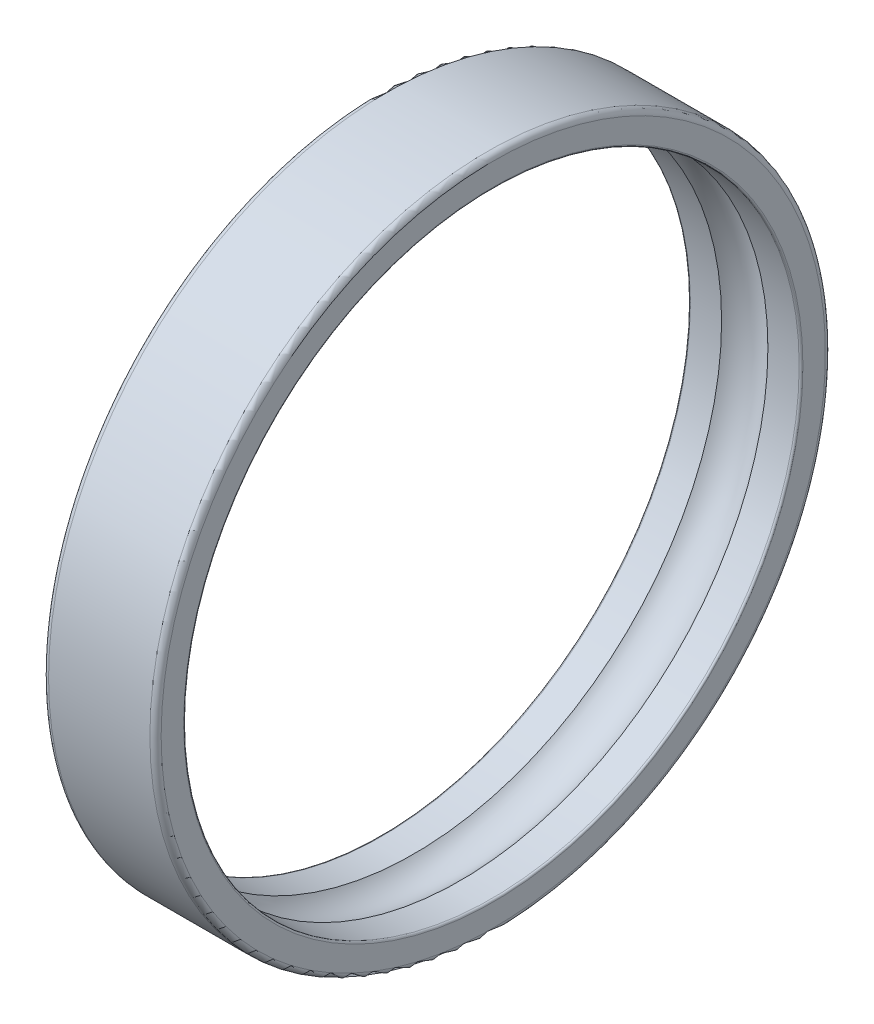
ISO-10303-21;
HEADER;
FILE_DESCRIPTION(('STEP AP214'),'2;1');
FILE_NAME('part.step','',(''),(''),'','','');
FILE_SCHEMA(('AUTOMOTIVE_DESIGN { 1 0 10303 214 1 1 1 1 }'));
ENDSEC;
DATA;
#1=APPLICATION_CONTEXT('core data for automotive mechanical design processes');
#2=APPLICATION_PROTOCOL_DEFINITION('international standard','automotive_design',2000,#1);
#3=PRODUCT_CONTEXT('',#1,'mechanical');
#4=PRODUCT('Part','Part','',(#3));
#5=PRODUCT_RELATED_PRODUCT_CATEGORY('part','',(#4));
#6=PRODUCT_DEFINITION_FORMATION('','',#4);
#7=PRODUCT_DEFINITION_CONTEXT('part definition',#1,'design');
#8=PRODUCT_DEFINITION('design','',#6,#7);
#9=PRODUCT_DEFINITION_SHAPE('','',#8);
#10=(LENGTH_UNIT() NAMED_UNIT(*) SI_UNIT(.MILLI.,.METRE.));
#11=(NAMED_UNIT(*) PLANE_ANGLE_UNIT() SI_UNIT($,.RADIAN.));
#12=(NAMED_UNIT(*) SI_UNIT($,.STERADIAN.) SOLID_ANGLE_UNIT());
#13=UNCERTAINTY_MEASURE_WITH_UNIT(LENGTH_MEASURE(1.E-05),#10,'distance_accuracy_value','');
#14=(GEOMETRIC_REPRESENTATION_CONTEXT(3) GLOBAL_UNCERTAINTY_ASSIGNED_CONTEXT((#13)) GLOBAL_UNIT_ASSIGNED_CONTEXT((#10,
#11,#12)) REPRESENTATION_CONTEXT('',''));
#15=CARTESIAN_POINT('',(0.,0.,0.));
#16=DIRECTION('',(0.,0.,1.));
#17=DIRECTION('',(1.,0.,0.));
#18=AXIS2_PLACEMENT_3D('',#15,#16,#17);
#19=CARTESIAN_POINT('',(0.,-35.792247571582,-35.4));
#20=DIRECTION('',(-1.,0.,0.));
#21=DIRECTION('',(0.,0.,1.));
#22=AXIS2_PLACEMENT_3D('',#19,#20,#21);
#23=PLANE('',#22);
#24=CARTESIAN_POINT('',(0.,0.,0.));
#25=DIRECTION('',(-1.,0.,0.));
#26=DIRECTION('',(0.,0.,-1.));
#27=AXIS2_PLACEMENT_3D('',#24,#25,#26);
#28=CIRCLE('',#27,35.4);
#29=CARTESIAN_POINT('',(0.,0.,-35.4));
#30=VERTEX_POINT('',#29);
#31=EDGE_CURVE('E50',#30,#30,#28,.F.);
#32=ORIENTED_EDGE('',*,*,#31,.F.);
#33=EDGE_LOOP('',(#32));
#34=FACE_BOUND('',#33,.T.);
#35=CARTESIAN_POINT('',(0.,0.,0.));
#36=DIRECTION('',(1.,0.,0.));
#37=DIRECTION('',(0.,-1.1684784856863E-09,1.));
#38=AXIS2_PLACEMENT_3D('',#35,#36,#37);
#39=CIRCLE('',#38,33.0000000000005);
#40=CARTESIAN_POINT('',(0.,-3.85597900276486E-08,33.0000000000005));
#41=VERTEX_POINT('',#40);
#42=EDGE_CURVE('E47',#41,#41,#39,.T.);
#43=ORIENTED_EDGE('',*,*,#42,.T.);
#44=EDGE_LOOP('',(#43));
#45=FACE_BOUND('',#44,.T.);
#46=ADVANCED_FACE('F15',(#34,#45),#23,.T.);
#47=CARTESIAN_POINT('',(12.,-35.7922475146052,35.4));
#48=DIRECTION('',(1.,0.,0.));
#49=DIRECTION('',(0.,0.,-1.));
#50=AXIS2_PLACEMENT_3D('',#47,#48,#49);
#51=PLANE('',#50);
#52=CARTESIAN_POINT('',(12.,0.,0.));
#53=DIRECTION('',(1.,0.,0.));
#54=DIRECTION('',(0.,-1.1685441315144E-09,1.));
#55=AXIS2_PLACEMENT_3D('',#52,#53,#54);
#56=CIRCLE('',#55,35.4);
#57=CARTESIAN_POINT('',(12.,-4.13664622556098E-08,35.4));
#58=VERTEX_POINT('',#57);
#59=EDGE_CURVE('E44',#58,#58,#56,.T.);
#60=ORIENTED_EDGE('',*,*,#59,.T.);
#61=EDGE_LOOP('',(#60));
#62=FACE_BOUND('',#61,.T.);
#63=CARTESIAN_POINT('',(12.,0.,0.));
#64=DIRECTION('',(-1.,0.,0.));
#65=DIRECTION('',(0.,0.,-1.));
#66=AXIS2_PLACEMENT_3D('',#63,#64,#65);
#67=CIRCLE('',#66,33.0000000168598);
#68=CARTESIAN_POINT('',(12.,0.,-33.0000000168598));
#69=VERTEX_POINT('',#68);
#70=EDGE_CURVE('E41',#69,#69,#67,.F.);
#71=ORIENTED_EDGE('',*,*,#70,.F.);
#72=EDGE_LOOP('',(#71));
#73=FACE_BOUND('',#72,.T.);
#74=ADVANCED_FACE('F59',(#62,#73),#51,.T.);
#75=CARTESIAN_POINT('',(0.599999999999892,0.,0.));
#76=DIRECTION('',(1.,0.,0.));
#77=DIRECTION('',(0.,1.92332050626273E-10,1.));
#78=AXIS2_PLACEMENT_3D('',#75,#76,#77);
#79=TOROIDAL_SURFACE('',#78,35.4,0.599999999999892);
#80=ORIENTED_EDGE('',*,*,#31,.T.);
#81=EDGE_LOOP('',(#80));
#82=FACE_BOUND('',#81,.T.);
#83=CARTESIAN_POINT('',(0.599999999999892,0.,0.));
#84=DIRECTION('',(-1.,0.,0.));
#85=DIRECTION('',(0.,0.,-1.));
#86=AXIS2_PLACEMENT_3D('',#83,#84,#85);
#87=CIRCLE('',#86,35.9999999999999);
#88=CARTESIAN_POINT('',(0.599999999999892,0.,-35.9999999999999));
#89=VERTEX_POINT('',#88);
#90=EDGE_CURVE('E38',#89,#89,#87,.F.);
#91=ORIENTED_EDGE('',*,*,#90,.F.);
#92=EDGE_LOOP('',(#91));
#93=FACE_BOUND('',#92,.T.);
#94=ADVANCED_FACE('F54',(#82,#93),#79,.T.);
#95=CARTESIAN_POINT('',(0.200000000000535,0.,0.));
#96=DIRECTION('',(1.,0.,0.));
#97=DIRECTION('',(0.,0.,1.));
#98=AXIS2_PLACEMENT_3D('',#95,#96,#97);
#99=TOROIDAL_SURFACE('',#98,33.0000000000005,0.200000000000535);
#100=CARTESIAN_POINT('',(0.2,0.,0.));
#101=DIRECTION('',(1.,0.,0.));
#102=DIRECTION('',(0.,0.,1.));
#103=AXIS2_PLACEMENT_3D('',#100,#101,#102);
#104=CIRCLE('',#103,32.8);
#105=CARTESIAN_POINT('',(0.2,0.,32.8));
#106=VERTEX_POINT('',#105);
#107=EDGE_CURVE('E35',#106,#106,#104,.T.);
#108=ORIENTED_EDGE('',*,*,#107,.T.);
#109=EDGE_LOOP('',(#108));
#110=FACE_BOUND('',#109,.T.);
#111=ORIENTED_EDGE('',*,*,#42,.F.);
#112=EDGE_LOOP('',(#111));
#113=FACE_BOUND('',#112,.T.);
#114=ADVANCED_FACE('F63',(#110,#113),#99,.T.);
#115=CARTESIAN_POINT('',(50.,0.,0.));
#116=DIRECTION('',(1.,0.,0.));
#117=DIRECTION('',(0.,0.,1.));
#118=AXIS2_PLACEMENT_3D('',#115,#116,#117);
#119=CYLINDRICAL_SURFACE('',#118,32.8);
#120=CARTESIAN_POINT('',(3.5321057052621,0.,0.));
#121=DIRECTION('',(1.,0.,0.));
#122=DIRECTION('',(0.,0.,1.));
#123=AXIS2_PLACEMENT_3D('',#120,#121,#122);
#124=CIRCLE('',#123,32.8);
#125=CARTESIAN_POINT('',(3.5321057052621,0.,32.8));
#126=VERTEX_POINT('',#125);
#127=EDGE_CURVE('E30',#126,#126,#124,.T.);
#128=ORIENTED_EDGE('',*,*,#127,.T.);
#129=EDGE_LOOP('',(#128));
#130=FACE_BOUND('',#129,.T.);
#131=ORIENTED_EDGE('',*,*,#107,.F.);
#132=EDGE_LOOP('',(#131));
#133=FACE_BOUND('',#132,.T.);
#134=ADVANCED_FACE('F65',(#130,#133),#119,.F.);
#135=CARTESIAN_POINT('',(6.,0.,0.));
#136=DIRECTION('',(1.,0.,0.));
#137=DIRECTION('',(0.,0.,1.));
#138=AXIS2_PLACEMENT_3D('',#135,#136,#137);
#139=TOROIDAL_SURFACE('',#138,30.5,3.37349999999993);
#140=ORIENTED_EDGE('',*,*,#127,.F.);
#141=EDGE_LOOP('',(#140));
#142=FACE_BOUND('',#141,.T.);
#143=CARTESIAN_POINT('',(8.46789429473786,0.,0.));
#144=DIRECTION('',(1.,0.,0.));
#145=DIRECTION('',(0.,-1.92336912722827E-10,1.));
#146=AXIS2_PLACEMENT_3D('',#143,#144,#145);
#147=CIRCLE('',#146,32.8);
#148=CARTESIAN_POINT('',(8.46789429473786,-6.30865073730871E-09,32.8));
#149=VERTEX_POINT('',#148);
#150=EDGE_CURVE('E26',#149,#149,#147,.T.);
#151=ORIENTED_EDGE('',*,*,#150,.T.);
#152=EDGE_LOOP('',(#151));
#153=FACE_BOUND('',#152,.T.);
#154=ADVANCED_FACE('F73',(#142,#153),#139,.F.);
#155=CARTESIAN_POINT('',(50.,0.,0.));
#156=DIRECTION('',(1.,0.,0.));
#157=DIRECTION('',(0.,0.,1.));
#158=AXIS2_PLACEMENT_3D('',#155,#156,#157);
#159=CYLINDRICAL_SURFACE('',#158,32.8);
#160=CARTESIAN_POINT('',(11.8,0.,0.));
#161=DIRECTION('',(1.,0.,0.));
#162=DIRECTION('',(0.,0.,1.));
#163=AXIS2_PLACEMENT_3D('',#160,#161,#162);
#164=CIRCLE('',#163,32.8);
#165=CARTESIAN_POINT('',(11.8,0.,32.8));
#166=VERTEX_POINT('',#165);
#167=EDGE_CURVE('E22',#166,#166,#164,.T.);
#168=ORIENTED_EDGE('',*,*,#167,.T.);
#169=EDGE_LOOP('',(#168));
#170=FACE_BOUND('',#169,.T.);
#171=ORIENTED_EDGE('',*,*,#150,.F.);
#172=EDGE_LOOP('',(#171));
#173=FACE_BOUND('',#172,.T.);
#174=ADVANCED_FACE('F81',(#170,#173),#159,.F.);
#175=CARTESIAN_POINT('',(11.7999999999989,0.,0.));
#176=DIRECTION('',(1.,0.,0.));
#177=DIRECTION('',(0.,0.,1.));
#178=AXIS2_PLACEMENT_3D('',#175,#176,#177);
#179=TOROIDAL_SURFACE('',#178,33.0000000000011,0.20000000000106);
#180=ORIENTED_EDGE('',*,*,#70,.T.);
#181=EDGE_LOOP('',(#180));
#182=FACE_BOUND('',#181,.T.);
#183=ORIENTED_EDGE('',*,*,#167,.F.);
#184=EDGE_LOOP('',(#183));
#185=FACE_BOUND('',#184,.T.);
#186=ADVANCED_FACE('F85',(#182,#185),#179,.T.);
#187=CARTESIAN_POINT('',(11.4000000000002,0.,0.));
#188=DIRECTION('',(1.,0.,0.));
#189=DIRECTION('',(0.,0.,1.));
#190=AXIS2_PLACEMENT_3D('',#187,#188,#189);
#191=TOROIDAL_SURFACE('',#190,35.4,0.599999999999771);
#192=CARTESIAN_POINT('',(11.4000000000002,0.,0.));
#193=DIRECTION('',(1.,0.,0.));
#194=DIRECTION('',(0.,0.,1.));
#195=AXIS2_PLACEMENT_3D('',#192,#193,#194);
#196=CIRCLE('',#195,35.9999999999998);
#197=CARTESIAN_POINT('',(11.4000000000002,0.,35.9999999999998));
#198=VERTEX_POINT('',#197);
#199=EDGE_CURVE('E10',#198,#198,#196,.T.);
#200=ORIENTED_EDGE('',*,*,#199,.T.);
#201=EDGE_LOOP('',(#200));
#202=FACE_BOUND('',#201,.T.);
#203=ORIENTED_EDGE('',*,*,#59,.F.);
#204=EDGE_LOOP('',(#203));
#205=FACE_BOUND('',#204,.T.);
#206=ADVANCED_FACE('F87',(#202,#205),#191,.T.);
#207=CARTESIAN_POINT('',(50.,0.,0.));
#208=DIRECTION('',(1.,0.,0.));
#209=DIRECTION('',(0.,1.92332050626273E-10,1.));
#210=AXIS2_PLACEMENT_3D('',#207,#208,#209);
#211=CYLINDRICAL_SURFACE('',#210,36.);
#212=ORIENTED_EDGE('',*,*,#90,.T.);
#213=EDGE_LOOP('',(#212));
#214=FACE_BOUND('',#213,.T.);
#215=ORIENTED_EDGE('',*,*,#199,.F.);
#216=EDGE_LOOP('',(#215));
#217=FACE_BOUND('',#216,.T.);
#218=ADVANCED_FACE('F17',(#214,#217),#211,.T.);
#219=CLOSED_SHELL('',(#46,#74,#94,#114,#134,#154,#174,#186,#206,#218));
#220=MANIFOLD_SOLID_BREP('B1',#219);
#221=ADVANCED_BREP_SHAPE_REPRESENTATION('',(#18,#220),#14);
#222=SHAPE_DEFINITION_REPRESENTATION(#9,#221);
ENDSEC;
END-ISO-10303-21;
